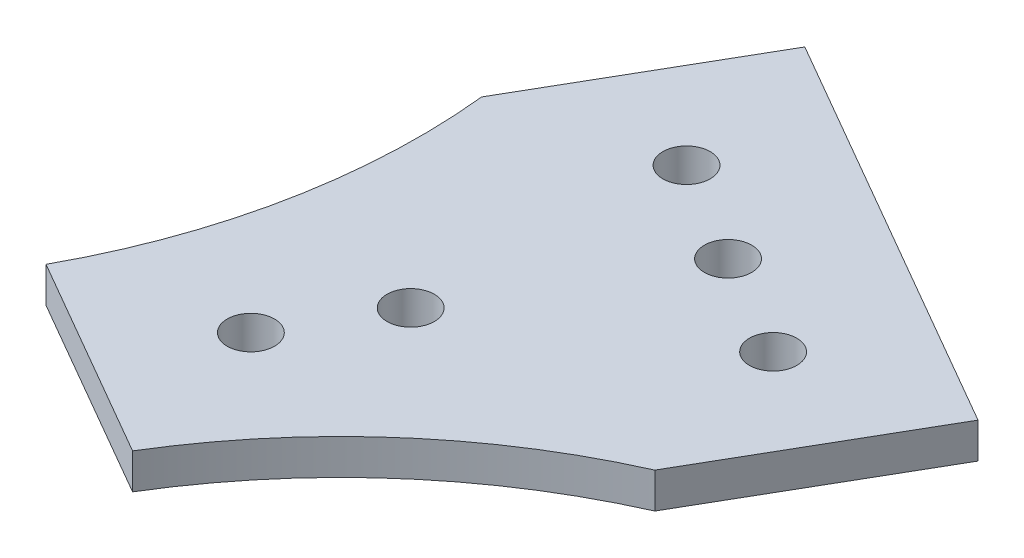
ISO-10303-21;
HEADER;
FILE_DESCRIPTION(('STEP AP214'),'2;1');
FILE_NAME('part.step','',(''),(''),'','','');
FILE_SCHEMA(('AUTOMOTIVE_DESIGN { 1 0 10303 214 1 1 1 1 }'));
ENDSEC;
DATA;
#1=APPLICATION_CONTEXT('core data for automotive mechanical design processes');
#2=APPLICATION_PROTOCOL_DEFINITION('international standard','automotive_design',2000,#1);
#3=PRODUCT_CONTEXT('',#1,'mechanical');
#4=PRODUCT('Part','Part','',(#3));
#5=PRODUCT_RELATED_PRODUCT_CATEGORY('part','',(#4));
#6=PRODUCT_DEFINITION_FORMATION('','',#4);
#7=PRODUCT_DEFINITION_CONTEXT('part definition',#1,'design');
#8=PRODUCT_DEFINITION('design','',#6,#7);
#9=PRODUCT_DEFINITION_SHAPE('','',#8);
#10=(LENGTH_UNIT() NAMED_UNIT(*) SI_UNIT(.MILLI.,.METRE.));
#11=(NAMED_UNIT(*) PLANE_ANGLE_UNIT() SI_UNIT($,.RADIAN.));
#12=(NAMED_UNIT(*) SI_UNIT($,.STERADIAN.) SOLID_ANGLE_UNIT());
#13=UNCERTAINTY_MEASURE_WITH_UNIT(LENGTH_MEASURE(1.E-05),#10,'distance_accuracy_value','');
#14=(GEOMETRIC_REPRESENTATION_CONTEXT(3) GLOBAL_UNCERTAINTY_ASSIGNED_CONTEXT((#13)) GLOBAL_UNIT_ASSIGNED_CONTEXT((#10,
#11,#12)) REPRESENTATION_CONTEXT('',''));
#15=CARTESIAN_POINT('',(0.,0.,0.));
#16=DIRECTION('',(0.,0.,1.));
#17=DIRECTION('',(1.,0.,0.));
#18=AXIS2_PLACEMENT_3D('',#15,#16,#17);
#19=CARTESIAN_POINT('',(15.9889100289675,3.,41.0852098038249));
#20=DIRECTION('',(0.,1.,0.));
#21=DIRECTION('',(0.,0.,1.));
#22=AXIS2_PLACEMENT_3D('',#19,#20,#21);
#23=PLANE('',#22);
#24=CARTESIAN_POINT('',(-27.533901491833,3.,-8.36837330104301));
#25=DIRECTION('',(0.,1.,0.));
#26=DIRECTION('',(0.,0.,1.));
#27=AXIS2_PLACEMENT_3D('',#24,#25,#26);
#28=CIRCLE('',#27,2.);
#29=CARTESIAN_POINT('',(-27.533901491833,3.,-6.36837330104301));
#30=VERTEX_POINT('',#29);
#31=EDGE_CURVE('E222',#30,#30,#28,.T.);
#32=ORIENTED_EDGE('',*,*,#31,.F.);
#33=EDGE_LOOP('',(#32));
#34=FACE_BOUND('',#33,.T.);
#35=CARTESIAN_POINT('',(-17.713393416144,3.,-25.3779922442758));
#36=DIRECTION('',(0.,1.,0.));
#37=DIRECTION('',(0.,0.,1.));
#38=AXIS2_PLACEMENT_3D('',#35,#36,#37);
#39=CIRCLE('',#38,1.99999999999994);
#40=CARTESIAN_POINT('',(-17.713393416144,3.,-23.3779922442759));
#41=VERTEX_POINT('',#40);
#42=EDGE_CURVE('E238',#41,#41,#39,.T.);
#43=ORIENTED_EDGE('',*,*,#42,.F.);
#44=EDGE_LOOP('',(#43));
#45=FACE_BOUND('',#44,.T.);
#46=CARTESIAN_POINT('',(15.9889100289675,3.,41.0852098038249));
#47=DIRECTION('',(0.,-1.,0.));
#48=DIRECTION('',(0.,0.,1.));
#49=AXIS2_PLACEMENT_3D('',#46,#47,#48);
#50=CIRCLE('',#49,52.4318675168023);
#51=CARTESIAN_POINT('',(-28.8184046383751,3.,13.8564514112492));
#52=VERTEX_POINT('',#51);
#53=CARTESIAN_POINT('',(-5.33764252484209,3.,-6.813421569828));
#54=VERTEX_POINT('',#53);
#55=EDGE_CURVE('E152',#52,#54,#50,.T.);
#56=ORIENTED_EDGE('',*,*,#55,.T.);
#57=DIRECTION('',(0.499999999999987,0.,-0.866025403784446));
#58=VECTOR('',#57,1.);
#59=CARTESIAN_POINT('',(-5.33764252484209,3.,-6.813421569828));
#60=LINE('',#59,#58);
#61=CARTESIAN_POINT('',(4.66235747515786,3.,-24.1339296455173));
#62=VERTEX_POINT('',#61);
#63=EDGE_CURVE('E100',#54,#62,#60,.T.);
#64=ORIENTED_EDGE('',*,*,#63,.T.);
#65=DIRECTION('',(-0.866025403784441,0.,-0.499999999999995));
#66=VECTOR('',#65,1.);
#67=CARTESIAN_POINT('',(4.66235747515786,3.,-24.1339296455173));
#68=LINE('',#67,#66);
#69=CARTESIAN_POINT('',(-29.9786586762194,3.,-44.1339296455169));
#70=VERTEX_POINT('',#69);
#71=EDGE_CURVE('E113',#62,#70,#68,.T.);
#72=ORIENTED_EDGE('',*,*,#71,.T.);
#73=DIRECTION('',(-0.500000000000002,0.,0.866025403784437));
#74=VECTOR('',#73,1.);
#75=CARTESIAN_POINT('',(-29.9786586762194,3.,-44.1339296455169));
#76=LINE('',#75,#74);
#77=CARTESIAN_POINT('',(-39.9786586762196,3.,-26.8134215698279));
#78=VERTEX_POINT('',#77);
#79=EDGE_CURVE('E107',#70,#78,#76,.T.);
#80=ORIENTED_EDGE('',*,*,#79,.T.);
#81=CARTESIAN_POINT('',(-92.1233665292144,3.,-21.3334421697441));
#82=DIRECTION('',(0.,-1.,0.));
#83=DIRECTION('',(0.,0.,1.));
#84=AXIS2_PLACEMENT_3D('',#81,#82,#83);
#85=CIRCLE('',#84,52.4318675168024);
#86=CARTESIAN_POINT('',(-46.1389127140637,3.,3.8564514112496));
#87=VERTEX_POINT('',#86);
#88=EDGE_CURVE('E111',#78,#87,#85,.T.);
#89=ORIENTED_EDGE('',*,*,#88,.T.);
#90=DIRECTION('',(0.866025403784443,0.,0.499999999999992));
#91=VECTOR('',#90,1.);
#92=CARTESIAN_POINT('',(-46.1389127140637,3.,3.85645141124957));
#93=LINE('',#92,#91);
#94=EDGE_CURVE('E63',#87,#52,#93,.T.);
#95=ORIENTED_EDGE('',*,*,#94,.T.);
#96=EDGE_LOOP('',(#56,#64,#72,#80,#89,#95));
#97=FACE_BOUND('',#96,.T.);
#98=CARTESIAN_POINT('',(-26.3184046383752,3.,-30.4736756076726));
#99=DIRECTION('',(0.,1.,0.));
#100=DIRECTION('',(0.,0.,1.));
#101=AXIS2_PLACEMENT_3D('',#98,#99,#100);
#102=CIRCLE('',#101,2.00000000000005);
#103=CARTESIAN_POINT('',(-26.3184046383752,3.,-28.4736756076725));
#104=VERTEX_POINT('',#103);
#105=EDGE_CURVE('E140',#104,#104,#102,.T.);
#106=ORIENTED_EDGE('',*,*,#105,.F.);
#107=EDGE_LOOP('',(#106));
#108=FACE_BOUND('',#107,.T.);
#109=CARTESIAN_POINT('',(-8.9978965626864,3.,-20.4736756076725));
#110=DIRECTION('',(0.,1.,0.));
#111=DIRECTION('',(0.,0.,1.));
#112=AXIS2_PLACEMENT_3D('',#109,#110,#111);
#113=CIRCLE('',#112,2.);
#114=CARTESIAN_POINT('',(-8.9978965626864,3.,-18.4736756076726));
#115=VERTEX_POINT('',#114);
#116=EDGE_CURVE('E230',#115,#115,#113,.T.);
#117=ORIENTED_EDGE('',*,*,#116,.F.);
#118=EDGE_LOOP('',(#117));
#119=FACE_BOUND('',#118,.T.);
#120=CARTESIAN_POINT('',(-32.4786586762195,3.,0.196197373404816));
#121=DIRECTION('',(0.,1.,0.));
#122=DIRECTION('',(0.,0.,1.));
#123=AXIS2_PLACEMENT_3D('',#120,#121,#122);
#124=CIRCLE('',#123,1.99999999999994);
#125=CARTESIAN_POINT('',(-32.4786586762195,3.,2.19619737340476));
#126=VERTEX_POINT('',#125);
#127=EDGE_CURVE('E211',#126,#126,#124,.T.);
#128=ORIENTED_EDGE('',*,*,#127,.F.);
#129=EDGE_LOOP('',(#128));
#130=FACE_BOUND('',#129,.T.);
#131=ADVANCED_FACE('F45',(#34,#45,#97,#108,#119,#130),#23,.T.);
#132=CARTESIAN_POINT('',(15.9889100289675,0.,41.0852098038249));
#133=DIRECTION('',(0.,1.,0.));
#134=DIRECTION('',(0.,0.,1.));
#135=AXIS2_PLACEMENT_3D('',#132,#133,#134);
#136=PLANE('',#135);
#137=CARTESIAN_POINT('',(15.9889100289675,0.,41.0852098038249));
#138=DIRECTION('',(0.,-1.,0.));
#139=DIRECTION('',(0.,0.,1.));
#140=AXIS2_PLACEMENT_3D('',#137,#138,#139);
#141=CIRCLE('',#140,52.4318675168023);
#142=CARTESIAN_POINT('',(-28.8184046383751,0.,13.8564514112492));
#143=VERTEX_POINT('',#142);
#144=CARTESIAN_POINT('',(-5.33764252484209,0.,-6.813421569828));
#145=VERTEX_POINT('',#144);
#146=EDGE_CURVE('E135',#143,#145,#141,.T.);
#147=ORIENTED_EDGE('',*,*,#146,.F.);
#148=DIRECTION('',(0.866025403784443,0.,0.499999999999992));
#149=VECTOR('',#148,1.);
#150=CARTESIAN_POINT('',(-46.1389127140637,0.,3.85645141124957));
#151=LINE('',#150,#149);
#152=CARTESIAN_POINT('',(-46.1389127140637,0.,3.8564514112496));
#153=VERTEX_POINT('',#152);
#154=EDGE_CURVE('E92',#153,#143,#151,.T.);
#155=ORIENTED_EDGE('',*,*,#154,.F.);
#156=CARTESIAN_POINT('',(-92.1233665292144,0.,-21.3334421697441));
#157=DIRECTION('',(0.,-1.,0.));
#158=DIRECTION('',(0.,0.,1.));
#159=AXIS2_PLACEMENT_3D('',#156,#157,#158);
#160=CIRCLE('',#159,52.4318675168024);
#161=CARTESIAN_POINT('',(-39.9786586762196,0.,-26.8134215698279));
#162=VERTEX_POINT('',#161);
#163=EDGE_CURVE('E86',#162,#153,#160,.T.);
#164=ORIENTED_EDGE('',*,*,#163,.F.);
#165=DIRECTION('',(-0.500000000000002,0.,0.866025403784437));
#166=VECTOR('',#165,1.);
#167=CARTESIAN_POINT('',(-29.9786586762194,0.,-44.1339296455169));
#168=LINE('',#167,#166);
#169=CARTESIAN_POINT('',(-29.9786586762194,0.,-44.1339296455169));
#170=VERTEX_POINT('',#169);
#171=EDGE_CURVE('E122',#170,#162,#168,.T.);
#172=ORIENTED_EDGE('',*,*,#171,.F.);
#173=DIRECTION('',(-0.866025403784441,0.,-0.499999999999995));
#174=VECTOR('',#173,1.);
#175=CARTESIAN_POINT('',(4.66235747515786,0.,-24.1339296455173));
#176=LINE('',#175,#174);
#177=CARTESIAN_POINT('',(4.66235747515786,0.,-24.1339296455173));
#178=VERTEX_POINT('',#177);
#179=EDGE_CURVE('E143',#178,#170,#176,.T.);
#180=ORIENTED_EDGE('',*,*,#179,.F.);
#181=DIRECTION('',(0.499999999999987,0.,-0.866025403784446));
#182=VECTOR('',#181,1.);
#183=CARTESIAN_POINT('',(-5.33764252484209,0.,-6.813421569828));
#184=LINE('',#183,#182);
#185=EDGE_CURVE('E139',#145,#178,#184,.T.);
#186=ORIENTED_EDGE('',*,*,#185,.F.);
#187=EDGE_LOOP('',(#147,#155,#164,#172,#180,#186));
#188=FACE_BOUND('',#187,.T.);
#189=CARTESIAN_POINT('',(-26.3184046383752,0.,-30.4736756076726));
#190=DIRECTION('',(0.,1.,0.));
#191=DIRECTION('',(0.,0.,1.));
#192=AXIS2_PLACEMENT_3D('',#189,#190,#191);
#193=CIRCLE('',#192,2.00000000000005);
#194=CARTESIAN_POINT('',(-26.3184046383752,0.,-28.4736756076725));
#195=VERTEX_POINT('',#194);
#196=EDGE_CURVE('E242',#195,#195,#193,.T.);
#197=ORIENTED_EDGE('',*,*,#196,.T.);
#198=EDGE_LOOP('',(#197));
#199=FACE_BOUND('',#198,.T.);
#200=CARTESIAN_POINT('',(-17.713393416144,0.,-25.3779922442758));
#201=DIRECTION('',(0.,1.,0.));
#202=DIRECTION('',(0.,0.,1.));
#203=AXIS2_PLACEMENT_3D('',#200,#201,#202);
#204=CIRCLE('',#203,1.99999999999994);
#205=CARTESIAN_POINT('',(-17.713393416144,0.,-23.3779922442759));
#206=VERTEX_POINT('',#205);
#207=EDGE_CURVE('E234',#206,#206,#204,.T.);
#208=ORIENTED_EDGE('',*,*,#207,.T.);
#209=EDGE_LOOP('',(#208));
#210=FACE_BOUND('',#209,.T.);
#211=CARTESIAN_POINT('',(-8.9978965626864,0.,-20.4736756076725));
#212=DIRECTION('',(0.,1.,0.));
#213=DIRECTION('',(0.,0.,1.));
#214=AXIS2_PLACEMENT_3D('',#211,#212,#213);
#215=CIRCLE('',#214,2.);
#216=CARTESIAN_POINT('',(-8.9978965626864,0.,-18.4736756076726));
#217=VERTEX_POINT('',#216);
#218=EDGE_CURVE('E226',#217,#217,#215,.T.);
#219=ORIENTED_EDGE('',*,*,#218,.T.);
#220=EDGE_LOOP('',(#219));
#221=FACE_BOUND('',#220,.T.);
#222=CARTESIAN_POINT('',(-27.533901491833,0.,-8.36837330104301));
#223=DIRECTION('',(0.,1.,0.));
#224=DIRECTION('',(0.,0.,1.));
#225=AXIS2_PLACEMENT_3D('',#222,#223,#224);
#226=CIRCLE('',#225,2.);
#227=CARTESIAN_POINT('',(-27.533901491833,0.,-6.36837330104301));
#228=VERTEX_POINT('',#227);
#229=EDGE_CURVE('E219',#228,#228,#226,.T.);
#230=ORIENTED_EDGE('',*,*,#229,.T.);
#231=EDGE_LOOP('',(#230));
#232=FACE_BOUND('',#231,.T.);
#233=CARTESIAN_POINT('',(-32.4786586762195,0.,0.196197373404816));
#234=DIRECTION('',(0.,1.,0.));
#235=DIRECTION('',(0.,0.,1.));
#236=AXIS2_PLACEMENT_3D('',#233,#234,#235);
#237=CIRCLE('',#236,1.99999999999994);
#238=CARTESIAN_POINT('',(-32.4786586762195,0.,2.19619737340476));
#239=VERTEX_POINT('',#238);
#240=EDGE_CURVE('E214',#239,#239,#237,.T.);
#241=ORIENTED_EDGE('',*,*,#240,.T.);
#242=EDGE_LOOP('',(#241));
#243=FACE_BOUND('',#242,.T.);
#244=ADVANCED_FACE('F165',(#188,#199,#210,#221,#232,#243),#136,.F.);
#245=CARTESIAN_POINT('',(15.9889100289675,3.,41.0852098038249));
#246=DIRECTION('',(0.,-1.,0.));
#247=DIRECTION('',(0.,0.,-1.));
#248=AXIS2_PLACEMENT_3D('',#245,#246,#247);
#249=CYLINDRICAL_SURFACE('',#248,52.4318675168023);
#250=ORIENTED_EDGE('',*,*,#146,.T.);
#251=DIRECTION('',(0.,-1.,0.));
#252=VECTOR('',#251,1.);
#253=CARTESIAN_POINT('',(-5.33764252484209,3.,-6.813421569828));
#254=LINE('',#253,#252);
#255=EDGE_CURVE('E11',#54,#145,#254,.T.);
#256=ORIENTED_EDGE('',*,*,#255,.F.);
#257=ORIENTED_EDGE('',*,*,#55,.F.);
#258=DIRECTION('',(0.,-1.,0.));
#259=VECTOR('',#258,1.);
#260=CARTESIAN_POINT('',(-28.8184046383751,3.,13.8564514112492));
#261=LINE('',#260,#259);
#262=EDGE_CURVE('E131',#52,#143,#261,.T.);
#263=ORIENTED_EDGE('',*,*,#262,.T.);
#264=EDGE_LOOP('',(#250,#256,#257,#263));
#265=FACE_BOUND('',#264,.T.);
#266=ADVANCED_FACE('F47',(#265),#249,.F.);
#267=CARTESIAN_POINT('',(-5.33764252484209,3.,-6.813421569828));
#268=DIRECTION('',(-0.866025403784446,0.,-0.499999999999987));
#269=DIRECTION('',(-0.499999999999987,0.,0.866025403784446));
#270=AXIS2_PLACEMENT_3D('',#267,#268,#269);
#271=PLANE('',#270);
#272=ORIENTED_EDGE('',*,*,#185,.T.);
#273=DIRECTION('',(0.,-1.,0.));
#274=VECTOR('',#273,1.);
#275=CARTESIAN_POINT('',(4.66235747515786,3.,-24.1339296455173));
#276=LINE('',#275,#274);
#277=EDGE_CURVE('E55',#62,#178,#276,.T.);
#278=ORIENTED_EDGE('',*,*,#277,.F.);
#279=ORIENTED_EDGE('',*,*,#63,.F.);
#280=ORIENTED_EDGE('',*,*,#255,.T.);
#281=EDGE_LOOP('',(#272,#278,#279,#280));
#282=FACE_BOUND('',#281,.T.);
#283=ADVANCED_FACE('F320',(#282),#271,.F.);
#284=CARTESIAN_POINT('',(4.66235747515786,3.,-24.1339296455173));
#285=DIRECTION('',(-0.499999999999995,0.,0.866025403784442));
#286=DIRECTION('',(0.866025403784442,0.,0.499999999999995));
#287=AXIS2_PLACEMENT_3D('',#284,#285,#286);
#288=PLANE('',#287);
#289=ORIENTED_EDGE('',*,*,#179,.T.);
#290=DIRECTION('',(0.,-1.,0.));
#291=VECTOR('',#290,1.);
#292=CARTESIAN_POINT('',(-29.9786586762194,3.,-44.1339296455169));
#293=LINE('',#292,#291);
#294=EDGE_CURVE('E124',#70,#170,#293,.T.);
#295=ORIENTED_EDGE('',*,*,#294,.F.);
#296=ORIENTED_EDGE('',*,*,#71,.F.);
#297=ORIENTED_EDGE('',*,*,#277,.T.);
#298=EDGE_LOOP('',(#289,#295,#296,#297));
#299=FACE_BOUND('',#298,.T.);
#300=ADVANCED_FACE('F162',(#299),#288,.F.);
#301=CARTESIAN_POINT('',(-29.9786586762194,3.,-44.1339296455169));
#302=DIRECTION('',(0.866025403784437,0.,0.500000000000002));
#303=DIRECTION('',(0.500000000000002,0.,-0.866025403784437));
#304=AXIS2_PLACEMENT_3D('',#301,#302,#303);
#305=PLANE('',#304);
#306=ORIENTED_EDGE('',*,*,#171,.T.);
#307=DIRECTION('',(0.,-1.,0.));
#308=VECTOR('',#307,1.);
#309=CARTESIAN_POINT('',(-39.9786586762196,3.,-26.8134215698279));
#310=LINE('',#309,#308);
#311=EDGE_CURVE('E119',#78,#162,#310,.T.);
#312=ORIENTED_EDGE('',*,*,#311,.F.);
#313=ORIENTED_EDGE('',*,*,#79,.F.);
#314=ORIENTED_EDGE('',*,*,#294,.T.);
#315=EDGE_LOOP('',(#306,#312,#313,#314));
#316=FACE_BOUND('',#315,.T.);
#317=ADVANCED_FACE('F120',(#316),#305,.F.);
#318=CARTESIAN_POINT('',(-92.1233665292144,3.,-21.3334421697441));
#319=DIRECTION('',(0.,-1.,0.));
#320=DIRECTION('',(0.,0.,-1.));
#321=AXIS2_PLACEMENT_3D('',#318,#319,#320);
#322=CYLINDRICAL_SURFACE('',#321,52.4318675168024);
#323=ORIENTED_EDGE('',*,*,#163,.T.);
#324=DIRECTION('',(0.,-1.,0.));
#325=VECTOR('',#324,1.);
#326=CARTESIAN_POINT('',(-46.1389127140637,3.,3.8564514112496));
#327=LINE('',#326,#325);
#328=EDGE_CURVE('E125',#87,#153,#327,.T.);
#329=ORIENTED_EDGE('',*,*,#328,.F.);
#330=ORIENTED_EDGE('',*,*,#88,.F.);
#331=ORIENTED_EDGE('',*,*,#311,.T.);
#332=EDGE_LOOP('',(#323,#329,#330,#331));
#333=FACE_BOUND('',#332,.T.);
#334=ADVANCED_FACE('F127',(#333),#322,.F.);
#335=CARTESIAN_POINT('',(-46.1389127140637,3.,3.85645141124957));
#336=DIRECTION('',(0.499999999999992,0.,-0.866025403784443));
#337=DIRECTION('',(-0.866025403784443,0.,-0.499999999999992));
#338=AXIS2_PLACEMENT_3D('',#335,#336,#337);
#339=PLANE('',#338);
#340=ORIENTED_EDGE('',*,*,#154,.T.);
#341=ORIENTED_EDGE('',*,*,#262,.F.);
#342=ORIENTED_EDGE('',*,*,#94,.F.);
#343=ORIENTED_EDGE('',*,*,#328,.T.);
#344=EDGE_LOOP('',(#340,#341,#342,#343));
#345=FACE_BOUND('',#344,.T.);
#346=ADVANCED_FACE('F170',(#345),#339,.F.);
#347=CARTESIAN_POINT('',(-26.3184046383752,3.,-30.4736756076726));
#348=DIRECTION('',(0.,-1.,0.));
#349=DIRECTION('',(0.,0.,-1.));
#350=AXIS2_PLACEMENT_3D('',#347,#348,#349);
#351=CYLINDRICAL_SURFACE('',#350,2.00000000000005);
#352=ORIENTED_EDGE('',*,*,#105,.T.);
#353=EDGE_LOOP('',(#352));
#354=FACE_BOUND('',#353,.T.);
#355=ORIENTED_EDGE('',*,*,#196,.F.);
#356=EDGE_LOOP('',(#355));
#357=FACE_BOUND('',#356,.T.);
#358=ADVANCED_FACE('F172',(#354,#357),#351,.F.);
#359=CARTESIAN_POINT('',(-17.713393416144,3.,-25.3779922442758));
#360=DIRECTION('',(0.,-1.,0.));
#361=DIRECTION('',(0.,0.,-1.));
#362=AXIS2_PLACEMENT_3D('',#359,#360,#361);
#363=CYLINDRICAL_SURFACE('',#362,1.99999999999994);
#364=ORIENTED_EDGE('',*,*,#42,.T.);
#365=EDGE_LOOP('',(#364));
#366=FACE_BOUND('',#365,.T.);
#367=ORIENTED_EDGE('',*,*,#207,.F.);
#368=EDGE_LOOP('',(#367));
#369=FACE_BOUND('',#368,.T.);
#370=ADVANCED_FACE('F178',(#366,#369),#363,.F.);
#371=CARTESIAN_POINT('',(-8.9978965626864,3.,-20.4736756076725));
#372=DIRECTION('',(0.,-1.,0.));
#373=DIRECTION('',(0.,0.,-1.));
#374=AXIS2_PLACEMENT_3D('',#371,#372,#373);
#375=CYLINDRICAL_SURFACE('',#374,2.);
#376=ORIENTED_EDGE('',*,*,#116,.T.);
#377=EDGE_LOOP('',(#376));
#378=FACE_BOUND('',#377,.T.);
#379=ORIENTED_EDGE('',*,*,#218,.F.);
#380=EDGE_LOOP('',(#379));
#381=FACE_BOUND('',#380,.T.);
#382=ADVANCED_FACE('F194',(#378,#381),#375,.F.);
#383=CARTESIAN_POINT('',(-27.533901491833,3.,-8.36837330104301));
#384=DIRECTION('',(0.,-1.,0.));
#385=DIRECTION('',(0.,0.,-1.));
#386=AXIS2_PLACEMENT_3D('',#383,#384,#385);
#387=CYLINDRICAL_SURFACE('',#386,2.);
#388=ORIENTED_EDGE('',*,*,#31,.T.);
#389=EDGE_LOOP('',(#388));
#390=FACE_BOUND('',#389,.T.);
#391=ORIENTED_EDGE('',*,*,#229,.F.);
#392=EDGE_LOOP('',(#391));
#393=FACE_BOUND('',#392,.T.);
#394=ADVANCED_FACE('F198',(#390,#393),#387,.F.);
#395=CARTESIAN_POINT('',(-32.4786586762195,3.,0.196197373404816));
#396=DIRECTION('',(0.,-1.,0.));
#397=DIRECTION('',(0.,0.,-1.));
#398=AXIS2_PLACEMENT_3D('',#395,#396,#397);
#399=CYLINDRICAL_SURFACE('',#398,1.99999999999994);
#400=ORIENTED_EDGE('',*,*,#127,.T.);
#401=EDGE_LOOP('',(#400));
#402=FACE_BOUND('',#401,.T.);
#403=ORIENTED_EDGE('',*,*,#240,.F.);
#404=EDGE_LOOP('',(#403));
#405=FACE_BOUND('',#404,.T.);
#406=ADVANCED_FACE('F202',(#402,#405),#399,.F.);
#407=CLOSED_SHELL('',(#131,#244,#266,#283,#300,#317,#334,#346,#358,#370,#382,#394,#406));
#408=MANIFOLD_SOLID_BREP('B2',#407);
#409=ADVANCED_BREP_SHAPE_REPRESENTATION('',(#18,#408),#14);
#410=SHAPE_DEFINITION_REPRESENTATION(#9,#409);
ENDSEC;
END-ISO-10303-21;
